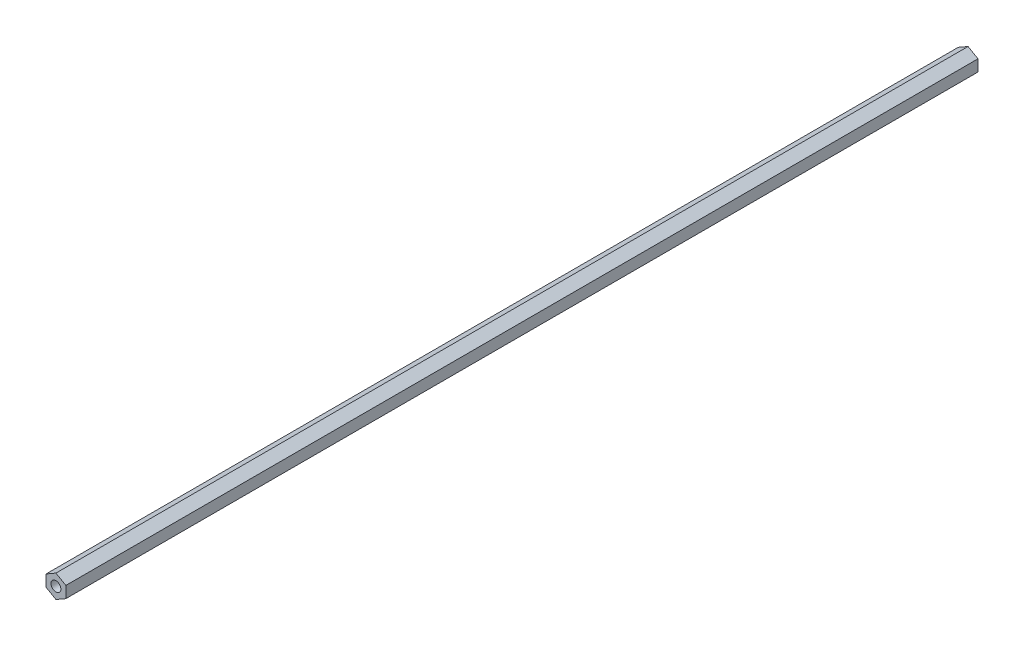
ISO-10303-21;
HEADER;
FILE_DESCRIPTION(('STEP AP214'),'2;1');
FILE_NAME('part.step','',(''),(''),'','','');
FILE_SCHEMA(('AUTOMOTIVE_DESIGN { 1 0 10303 214 1 1 1 1 }'));
ENDSEC;
DATA;
#1=APPLICATION_CONTEXT('core data for automotive mechanical design processes');
#2=APPLICATION_PROTOCOL_DEFINITION('international standard','automotive_design',2000,#1);
#3=PRODUCT_CONTEXT('',#1,'mechanical');
#4=PRODUCT('Part','Part','',(#3));
#5=PRODUCT_RELATED_PRODUCT_CATEGORY('part','',(#4));
#6=PRODUCT_DEFINITION_FORMATION('','',#4);
#7=PRODUCT_DEFINITION_CONTEXT('part definition',#1,'design');
#8=PRODUCT_DEFINITION('design','',#6,#7);
#9=PRODUCT_DEFINITION_SHAPE('','',#8);
#10=(LENGTH_UNIT() NAMED_UNIT(*) SI_UNIT(.MILLI.,.METRE.));
#11=(NAMED_UNIT(*) PLANE_ANGLE_UNIT() SI_UNIT($,.RADIAN.));
#12=(NAMED_UNIT(*) SI_UNIT($,.STERADIAN.) SOLID_ANGLE_UNIT());
#13=UNCERTAINTY_MEASURE_WITH_UNIT(LENGTH_MEASURE(1.E-05),#10,'distance_accuracy_value','');
#14=(GEOMETRIC_REPRESENTATION_CONTEXT(3) GLOBAL_UNCERTAINTY_ASSIGNED_CONTEXT((#13)) GLOBAL_UNIT_ASSIGNED_CONTEXT((#10,
#11,#12)) REPRESENTATION_CONTEXT('',''));
#15=CARTESIAN_POINT('',(0.,0.,0.));
#16=DIRECTION('',(0.,0.,1.));
#17=DIRECTION('',(1.,0.,0.));
#18=AXIS2_PLACEMENT_3D('',#15,#16,#17);
#19=CARTESIAN_POINT('',(-6.35,3.66617420935411,292.1));
#20=DIRECTION('',(1.,0.,0.));
#21=DIRECTION('',(0.,0.,-1.));
#22=AXIS2_PLACEMENT_3D('',#19,#20,#21);
#23=PLANE('',#22);
#24=DIRECTION('',(0.,0.,-1.));
#25=VECTOR('',#24,1.);
#26=CARTESIAN_POINT('',(-6.35,3.66617420935411,292.1));
#27=LINE('',#26,#25);
#28=CARTESIAN_POINT('',(-6.35,3.66617420935411,292.1));
#29=VERTEX_POINT('',#28);
#30=CARTESIAN_POINT('',(-6.35,3.66617420935411,-292.1));
#31=VERTEX_POINT('',#30);
#32=EDGE_CURVE('E141',#29,#31,#27,.T.);
#33=ORIENTED_EDGE('',*,*,#32,.T.);
#34=DIRECTION('',(0.,-1.,0.));
#35=VECTOR('',#34,1.);
#36=CARTESIAN_POINT('',(-6.35,3.66617420935411,-292.1));
#37=LINE('',#36,#35);
#38=CARTESIAN_POINT('',(-6.35,-3.66617420935413,-292.1));
#39=VERTEX_POINT('',#38);
#40=EDGE_CURVE('E113',#31,#39,#37,.T.);
#41=ORIENTED_EDGE('',*,*,#40,.T.);
#42=DIRECTION('',(0.,0.,-1.));
#43=VECTOR('',#42,1.);
#44=CARTESIAN_POINT('',(-6.35,-3.66617420935413,292.1));
#45=LINE('',#44,#43);
#46=CARTESIAN_POINT('',(-6.35,-3.66617420935413,292.1));
#47=VERTEX_POINT('',#46);
#48=EDGE_CURVE('E11',#47,#39,#45,.T.);
#49=ORIENTED_EDGE('',*,*,#48,.F.);
#50=DIRECTION('',(0.,-1.,0.));
#51=VECTOR('',#50,1.);
#52=CARTESIAN_POINT('',(-6.35,3.66617420935411,292.1));
#53=LINE('',#52,#51);
#54=EDGE_CURVE('E131',#29,#47,#53,.T.);
#55=ORIENTED_EDGE('',*,*,#54,.F.);
#56=EDGE_LOOP('',(#33,#41,#49,#55));
#57=FACE_BOUND('',#56,.T.);
#58=ADVANCED_FACE('F37',(#57),#23,.F.);
#59=CARTESIAN_POINT('',(-6.35,-3.66617420935413,292.1));
#60=DIRECTION('',(0.5,0.866025403784439,0.));
#61=DIRECTION('',(-0.866025403784439,0.5,0.));
#62=AXIS2_PLACEMENT_3D('',#59,#60,#61);
#63=PLANE('',#62);
#64=ORIENTED_EDGE('',*,*,#48,.T.);
#65=DIRECTION('',(0.866025403784439,-0.5,0.));
#66=VECTOR('',#65,1.);
#67=CARTESIAN_POINT('',(-6.35,-3.66617420935413,-292.1));
#68=LINE('',#67,#66);
#69=CARTESIAN_POINT('',(0.,-7.33234841870826,-292.1));
#70=VERTEX_POINT('',#69);
#71=EDGE_CURVE('E116',#39,#70,#68,.T.);
#72=ORIENTED_EDGE('',*,*,#71,.T.);
#73=DIRECTION('',(0.,0.,-1.));
#74=VECTOR('',#73,1.);
#75=CARTESIAN_POINT('',(0.,-7.33234841870826,292.1));
#76=LINE('',#75,#74);
#77=CARTESIAN_POINT('',(0.,-7.33234841870826,292.1));
#78=VERTEX_POINT('',#77);
#79=EDGE_CURVE('E44',#78,#70,#76,.T.);
#80=ORIENTED_EDGE('',*,*,#79,.F.);
#81=DIRECTION('',(0.866025403784439,-0.5,0.));
#82=VECTOR('',#81,1.);
#83=CARTESIAN_POINT('',(-6.35,-3.66617420935413,292.1));
#84=LINE('',#83,#82);
#85=EDGE_CURVE('E133',#47,#78,#84,.T.);
#86=ORIENTED_EDGE('',*,*,#85,.F.);
#87=EDGE_LOOP('',(#64,#72,#80,#86));
#88=FACE_BOUND('',#87,.T.);
#89=ADVANCED_FACE('F161',(#88),#63,.F.);
#90=CARTESIAN_POINT('',(0.,-7.33234841870826,292.1));
#91=DIRECTION('',(-0.5,0.866025403784439,0.));
#92=DIRECTION('',(-0.866025403784439,-0.5,0.));
#93=AXIS2_PLACEMENT_3D('',#90,#91,#92);
#94=PLANE('',#93);
#95=ORIENTED_EDGE('',*,*,#79,.T.);
#96=DIRECTION('',(0.866025403784439,0.5,0.));
#97=VECTOR('',#96,1.);
#98=CARTESIAN_POINT('',(0.,-7.33234841870826,-292.1));
#99=LINE('',#98,#97);
#100=CARTESIAN_POINT('',(6.35,-3.66617420935414,-292.1));
#101=VERTEX_POINT('',#100);
#102=EDGE_CURVE('E119',#70,#101,#99,.T.);
#103=ORIENTED_EDGE('',*,*,#102,.T.);
#104=DIRECTION('',(0.,0.,-1.));
#105=VECTOR('',#104,1.);
#106=CARTESIAN_POINT('',(6.35,-3.66617420935414,292.1));
#107=LINE('',#106,#105);
#108=CARTESIAN_POINT('',(6.35,-3.66617420935414,292.1));
#109=VERTEX_POINT('',#108);
#110=EDGE_CURVE('E147',#109,#101,#107,.T.);
#111=ORIENTED_EDGE('',*,*,#110,.F.);
#112=DIRECTION('',(0.866025403784439,0.5,0.));
#113=VECTOR('',#112,1.);
#114=CARTESIAN_POINT('',(0.,-7.33234841870826,292.1));
#115=LINE('',#114,#113);
#116=EDGE_CURVE('E135',#78,#109,#115,.T.);
#117=ORIENTED_EDGE('',*,*,#116,.F.);
#118=EDGE_LOOP('',(#95,#103,#111,#117));
#119=FACE_BOUND('',#118,.T.);
#120=ADVANCED_FACE('F152',(#119),#94,.F.);
#121=CARTESIAN_POINT('',(6.35,-3.66617420935414,292.1));
#122=DIRECTION('',(-1.,0.,0.));
#123=DIRECTION('',(0.,-1.,0.));
#124=AXIS2_PLACEMENT_3D('',#121,#122,#123);
#125=PLANE('',#124);
#126=ORIENTED_EDGE('',*,*,#110,.T.);
#127=DIRECTION('',(0.,1.,0.));
#128=VECTOR('',#127,1.);
#129=CARTESIAN_POINT('',(6.35,-3.66617420935414,-292.1));
#130=LINE('',#129,#128);
#131=CARTESIAN_POINT('',(6.35,3.66617420935412,-292.1));
#132=VERTEX_POINT('',#131);
#133=EDGE_CURVE('E122',#101,#132,#130,.T.);
#134=ORIENTED_EDGE('',*,*,#133,.T.);
#135=DIRECTION('',(0.,0.,-1.));
#136=VECTOR('',#135,1.);
#137=CARTESIAN_POINT('',(6.35,3.66617420935412,292.1));
#138=LINE('',#137,#136);
#139=CARTESIAN_POINT('',(6.35,3.66617420935412,292.1));
#140=VERTEX_POINT('',#139);
#141=EDGE_CURVE('E145',#140,#132,#138,.T.);
#142=ORIENTED_EDGE('',*,*,#141,.F.);
#143=DIRECTION('',(0.,1.,0.));
#144=VECTOR('',#143,1.);
#145=CARTESIAN_POINT('',(6.35,-3.66617420935414,292.1));
#146=LINE('',#145,#144);
#147=EDGE_CURVE('E137',#109,#140,#146,.T.);
#148=ORIENTED_EDGE('',*,*,#147,.F.);
#149=EDGE_LOOP('',(#126,#134,#142,#148));
#150=FACE_BOUND('',#149,.T.);
#151=ADVANCED_FACE('F172',(#150),#125,.F.);
#152=CARTESIAN_POINT('',(6.35,3.66617420935412,292.1));
#153=DIRECTION('',(-0.5,-0.866025403784439,0.));
#154=DIRECTION('',(0.866025403784439,-0.5,0.));
#155=AXIS2_PLACEMENT_3D('',#152,#153,#154);
#156=PLANE('',#155);
#157=ORIENTED_EDGE('',*,*,#141,.T.);
#158=DIRECTION('',(-0.866025403784439,0.5,0.));
#159=VECTOR('',#158,1.);
#160=CARTESIAN_POINT('',(6.35,3.66617420935412,-292.1));
#161=LINE('',#160,#159);
#162=CARTESIAN_POINT('',(0.,7.33234841870824,-292.1));
#163=VERTEX_POINT('',#162);
#164=EDGE_CURVE('E125',#132,#163,#161,.T.);
#165=ORIENTED_EDGE('',*,*,#164,.T.);
#166=DIRECTION('',(0.,0.,-1.));
#167=VECTOR('',#166,1.);
#168=CARTESIAN_POINT('',(0.,7.33234841870824,292.1));
#169=LINE('',#168,#167);
#170=CARTESIAN_POINT('',(0.,7.33234841870824,292.1));
#171=VERTEX_POINT('',#170);
#172=EDGE_CURVE('E143',#171,#163,#169,.T.);
#173=ORIENTED_EDGE('',*,*,#172,.F.);
#174=DIRECTION('',(-0.866025403784439,0.5,0.));
#175=VECTOR('',#174,1.);
#176=CARTESIAN_POINT('',(6.35,3.66617420935412,292.1));
#177=LINE('',#176,#175);
#178=EDGE_CURVE('E56',#140,#171,#177,.T.);
#179=ORIENTED_EDGE('',*,*,#178,.F.);
#180=EDGE_LOOP('',(#157,#165,#173,#179));
#181=FACE_BOUND('',#180,.T.);
#182=ADVANCED_FACE('F169',(#181),#156,.F.);
#183=CARTESIAN_POINT('',(0.,7.33234841870824,292.1));
#184=DIRECTION('',(0.5,-0.866025403784439,0.));
#185=DIRECTION('',(0.866025403784439,0.5,0.));
#186=AXIS2_PLACEMENT_3D('',#183,#184,#185);
#187=PLANE('',#186);
#188=ORIENTED_EDGE('',*,*,#172,.T.);
#189=DIRECTION('',(-0.866025403784439,-0.5,0.));
#190=VECTOR('',#189,1.);
#191=CARTESIAN_POINT('',(0.,7.33234841870824,-292.1));
#192=LINE('',#191,#190);
#193=EDGE_CURVE('E128',#163,#31,#192,.T.);
#194=ORIENTED_EDGE('',*,*,#193,.T.);
#195=ORIENTED_EDGE('',*,*,#32,.F.);
#196=DIRECTION('',(-0.866025403784439,-0.5,0.));
#197=VECTOR('',#196,1.);
#198=CARTESIAN_POINT('',(0.,7.33234841870824,292.1));
#199=LINE('',#198,#197);
#200=EDGE_CURVE('E51',#171,#29,#199,.T.);
#201=ORIENTED_EDGE('',*,*,#200,.F.);
#202=EDGE_LOOP('',(#188,#194,#195,#201));
#203=FACE_BOUND('',#202,.T.);
#204=ADVANCED_FACE('F167',(#203),#187,.F.);
#205=CARTESIAN_POINT('',(0.,0.,292.1));
#206=DIRECTION('',(0.,0.,1.));
#207=DIRECTION('',(1.,0.,0.));
#208=AXIS2_PLACEMENT_3D('',#205,#206,#207);
#209=PLANE('',#208);
#210=CARTESIAN_POINT('',(0.,0.,292.1));
#211=DIRECTION('',(0.,0.,1.));
#212=DIRECTION('',(1.,0.,0.));
#213=AXIS2_PLACEMENT_3D('',#210,#211,#212);
#214=CIRCLE('',#213,3.17499999999999);
#215=CARTESIAN_POINT('',(3.17499999999999,0.,292.1));
#216=VERTEX_POINT('',#215);
#217=EDGE_CURVE('E102',#216,#216,#214,.T.);
#218=ORIENTED_EDGE('',*,*,#217,.F.);
#219=EDGE_LOOP('',(#218));
#220=FACE_BOUND('',#219,.T.);
#221=ORIENTED_EDGE('',*,*,#54,.T.);
#222=ORIENTED_EDGE('',*,*,#85,.T.);
#223=ORIENTED_EDGE('',*,*,#116,.T.);
#224=ORIENTED_EDGE('',*,*,#147,.T.);
#225=ORIENTED_EDGE('',*,*,#178,.T.);
#226=ORIENTED_EDGE('',*,*,#200,.T.);
#227=EDGE_LOOP('',(#221,#222,#223,#224,#225,#226));
#228=FACE_BOUND('',#227,.T.);
#229=ADVANCED_FACE('F174',(#220,#228),#209,.T.);
#230=CARTESIAN_POINT('',(0.,0.,-292.1));
#231=DIRECTION('',(0.,0.,1.));
#232=DIRECTION('',(1.,0.,0.));
#233=AXIS2_PLACEMENT_3D('',#230,#231,#232);
#234=PLANE('',#233);
#235=CARTESIAN_POINT('',(0.,0.,-292.1));
#236=DIRECTION('',(0.,0.,-1.));
#237=DIRECTION('',(-1.,0.,0.));
#238=AXIS2_PLACEMENT_3D('',#235,#236,#237);
#239=CIRCLE('',#238,3.17499999999999);
#240=CARTESIAN_POINT('',(-3.17499999999999,0.,-292.1));
#241=VERTEX_POINT('',#240);
#242=EDGE_CURVE('E103',#241,#241,#239,.T.);
#243=ORIENTED_EDGE('',*,*,#242,.F.);
#244=EDGE_LOOP('',(#243));
#245=FACE_BOUND('',#244,.T.);
#246=ORIENTED_EDGE('',*,*,#40,.F.);
#247=ORIENTED_EDGE('',*,*,#193,.F.);
#248=ORIENTED_EDGE('',*,*,#164,.F.);
#249=ORIENTED_EDGE('',*,*,#133,.F.);
#250=ORIENTED_EDGE('',*,*,#102,.F.);
#251=ORIENTED_EDGE('',*,*,#71,.F.);
#252=EDGE_LOOP('',(#246,#247,#248,#249,#250,#251));
#253=FACE_BOUND('',#252,.T.);
#254=ADVANCED_FACE('F159',(#245,#253),#234,.F.);
#255=CARTESIAN_POINT('',(0.,0.,266.7));
#256=DIRECTION('',(0.,0.,1.));
#257=DIRECTION('',(1.,0.,0.));
#258=AXIS2_PLACEMENT_3D('',#255,#256,#257);
#259=CONICAL_SURFACE('',#258,3.17499999999995,1.02974425867665);
#260=CARTESIAN_POINT('',(0.,0.,264.792267534587));
#261=VERTEX_POINT('',#260);
#262=VERTEX_LOOP('',#261);
#263=FACE_BOUND('',#262,.T.);
#264=CARTESIAN_POINT('',(0.,0.,266.7));
#265=DIRECTION('',(0.,0.,1.));
#266=DIRECTION('',(1.,0.,0.));
#267=AXIS2_PLACEMENT_3D('',#264,#265,#266);
#268=CIRCLE('',#267,3.17499999999995);
#269=CARTESIAN_POINT('',(3.17499999999995,0.,266.7));
#270=VERTEX_POINT('',#269);
#271=EDGE_CURVE('E106',#270,#270,#268,.T.);
#272=ORIENTED_EDGE('',*,*,#271,.T.);
#273=EDGE_LOOP('',(#272));
#274=FACE_BOUND('',#273,.T.);
#275=ADVANCED_FACE('F182',(#263,#274),#259,.F.);
#276=CARTESIAN_POINT('',(0.,0.,292.1));
#277=DIRECTION('',(0.,0.,1.));
#278=DIRECTION('',(1.,0.,0.));
#279=AXIS2_PLACEMENT_3D('',#276,#277,#278);
#280=CYLINDRICAL_SURFACE('',#279,3.17499999999997);
#281=ORIENTED_EDGE('',*,*,#271,.F.);
#282=EDGE_LOOP('',(#281));
#283=FACE_BOUND('',#282,.T.);
#284=ORIENTED_EDGE('',*,*,#217,.T.);
#285=EDGE_LOOP('',(#284));
#286=FACE_BOUND('',#285,.T.);
#287=ADVANCED_FACE('F96',(#283,#286),#280,.F.);
#288=CARTESIAN_POINT('',(0.,0.,-266.7));
#289=DIRECTION('',(0.,0.,-1.));
#290=DIRECTION('',(-1.,0.,0.));
#291=AXIS2_PLACEMENT_3D('',#288,#289,#290);
#292=CONICAL_SURFACE('',#291,3.17499999999995,1.02974425867665);
#293=CARTESIAN_POINT('',(0.,0.,-264.792267534587));
#294=VERTEX_POINT('',#293);
#295=VERTEX_LOOP('',#294);
#296=FACE_BOUND('',#295,.T.);
#297=CARTESIAN_POINT('',(0.,0.,-266.7));
#298=DIRECTION('',(0.,0.,-1.));
#299=DIRECTION('',(-1.,0.,0.));
#300=AXIS2_PLACEMENT_3D('',#297,#298,#299);
#301=CIRCLE('',#300,3.17499999999995);
#302=CARTESIAN_POINT('',(-3.17499999999995,0.,-266.7));
#303=VERTEX_POINT('',#302);
#304=EDGE_CURVE('E100',#303,#303,#301,.T.);
#305=ORIENTED_EDGE('',*,*,#304,.T.);
#306=EDGE_LOOP('',(#305));
#307=FACE_BOUND('',#306,.T.);
#308=ADVANCED_FACE('F92',(#296,#307),#292,.F.);
#309=CARTESIAN_POINT('',(0.,0.,-292.1));
#310=DIRECTION('',(0.,0.,-1.));
#311=DIRECTION('',(-1.,0.,0.));
#312=AXIS2_PLACEMENT_3D('',#309,#310,#311);
#313=CYLINDRICAL_SURFACE('',#312,3.17499999999997);
#314=ORIENTED_EDGE('',*,*,#304,.F.);
#315=EDGE_LOOP('',(#314));
#316=FACE_BOUND('',#315,.T.);
#317=ORIENTED_EDGE('',*,*,#242,.T.);
#318=EDGE_LOOP('',(#317));
#319=FACE_BOUND('',#318,.T.);
#320=ADVANCED_FACE('F95',(#316,#319),#313,.F.);
#321=CLOSED_SHELL('',(#58,#89,#120,#151,#182,#204,#229,#254,#275,#287,#308,#320));
#322=MANIFOLD_SOLID_BREP('B2',#321);
#323=ADVANCED_BREP_SHAPE_REPRESENTATION('',(#18,#322),#14);
#324=SHAPE_DEFINITION_REPRESENTATION(#9,#323);
ENDSEC;
END-ISO-10303-21;
